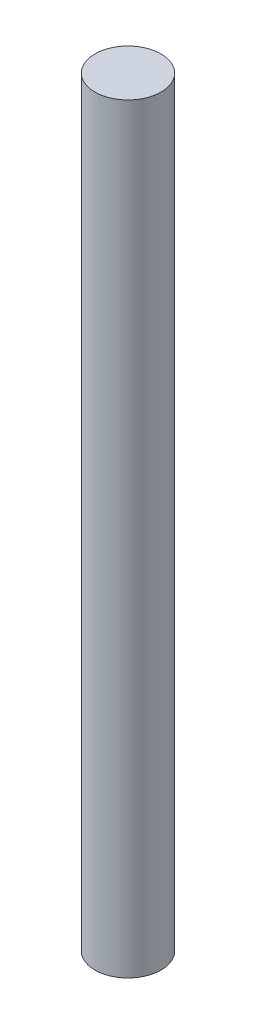
ISO-10303-21;
HEADER;
FILE_DESCRIPTION(('STEP AP214'),'2;1');
FILE_NAME('part.step','',(''),(''),'','','');
FILE_SCHEMA(('AUTOMOTIVE_DESIGN { 1 0 10303 214 1 1 1 1 }'));
ENDSEC;
DATA;
#1=APPLICATION_CONTEXT('core data for automotive mechanical design processes');
#2=APPLICATION_PROTOCOL_DEFINITION('international standard','automotive_design',2000,#1);
#3=PRODUCT_CONTEXT('',#1,'mechanical');
#4=PRODUCT('Part','Part','',(#3));
#5=PRODUCT_RELATED_PRODUCT_CATEGORY('part','',(#4));
#6=PRODUCT_DEFINITION_FORMATION('','',#4);
#7=PRODUCT_DEFINITION_CONTEXT('part definition',#1,'design');
#8=PRODUCT_DEFINITION('design','',#6,#7);
#9=PRODUCT_DEFINITION_SHAPE('','',#8);
#10=(LENGTH_UNIT() NAMED_UNIT(*) SI_UNIT(.MILLI.,.METRE.));
#11=(NAMED_UNIT(*) PLANE_ANGLE_UNIT() SI_UNIT($,.RADIAN.));
#12=(NAMED_UNIT(*) SI_UNIT($,.STERADIAN.) SOLID_ANGLE_UNIT());
#13=UNCERTAINTY_MEASURE_WITH_UNIT(LENGTH_MEASURE(1.E-05),#10,'distance_accuracy_value','');
#14=(GEOMETRIC_REPRESENTATION_CONTEXT(3) GLOBAL_UNCERTAINTY_ASSIGNED_CONTEXT((#13)) GLOBAL_UNIT_ASSIGNED_CONTEXT((#10,
#11,#12)) REPRESENTATION_CONTEXT('',''));
#15=CARTESIAN_POINT('',(0.,0.,0.));
#16=DIRECTION('',(0.,0.,1.));
#17=DIRECTION('',(1.,0.,0.));
#18=AXIS2_PLACEMENT_3D('',#15,#16,#17);
#19=CARTESIAN_POINT('',(0.,115.,0.));
#20=DIRECTION('',(0.,-1.,0.));
#21=DIRECTION('',(0.,0.,-1.));
#22=AXIS2_PLACEMENT_3D('',#19,#20,#21);
#23=CYLINDRICAL_SURFACE('',#22,5.);
#24=CARTESIAN_POINT('',(0.,115.,0.));
#25=DIRECTION('',(0.,1.,0.));
#26=DIRECTION('',(0.,0.,1.));
#27=AXIS2_PLACEMENT_3D('',#24,#25,#26);
#28=CIRCLE('',#27,5.);
#29=CARTESIAN_POINT('',(0.,115.,5.));
#30=VERTEX_POINT('',#29);
#31=EDGE_CURVE('E10',#30,#30,#28,.T.);
#32=ORIENTED_EDGE('',*,*,#31,.F.);
#33=EDGE_LOOP('',(#32));
#34=FACE_BOUND('',#33,.T.);
#35=CARTESIAN_POINT('',(0.,0.,0.));
#36=DIRECTION('',(0.,1.,0.));
#37=DIRECTION('',(0.,0.,1.));
#38=AXIS2_PLACEMENT_3D('',#35,#36,#37);
#39=CIRCLE('',#38,5.);
#40=CARTESIAN_POINT('',(0.,0.,5.));
#41=VERTEX_POINT('',#40);
#42=EDGE_CURVE('E43',#41,#41,#39,.T.);
#43=ORIENTED_EDGE('',*,*,#42,.T.);
#44=EDGE_LOOP('',(#43));
#45=FACE_BOUND('',#44,.T.);
#46=ADVANCED_FACE('F40',(#34,#45),#23,.T.);
#47=CARTESIAN_POINT('',(0.,115.,0.));
#48=DIRECTION('',(0.,1.,0.));
#49=DIRECTION('',(0.,0.,1.));
#50=AXIS2_PLACEMENT_3D('',#47,#48,#49);
#51=PLANE('',#50);
#52=ORIENTED_EDGE('',*,*,#31,.T.);
#53=EDGE_LOOP('',(#52));
#54=FACE_BOUND('',#53,.T.);
#55=ADVANCED_FACE('F55',(#54),#51,.T.);
#56=CARTESIAN_POINT('',(0.,0.,0.));
#57=DIRECTION('',(0.,1.,0.));
#58=DIRECTION('',(0.,0.,1.));
#59=AXIS2_PLACEMENT_3D('',#56,#57,#58);
#60=PLANE('',#59);
#61=ORIENTED_EDGE('',*,*,#42,.F.);
#62=EDGE_LOOP('',(#61));
#63=FACE_BOUND('',#62,.T.);
#64=ADVANCED_FACE('F53',(#63),#60,.F.);
#65=CLOSED_SHELL('',(#46,#55,#64));
#66=MANIFOLD_SOLID_BREP('B2',#65);
#67=ADVANCED_BREP_SHAPE_REPRESENTATION('',(#18,#66),#14);
#68=SHAPE_DEFINITION_REPRESENTATION(#9,#67);
ENDSEC;
END-ISO-10303-21;
